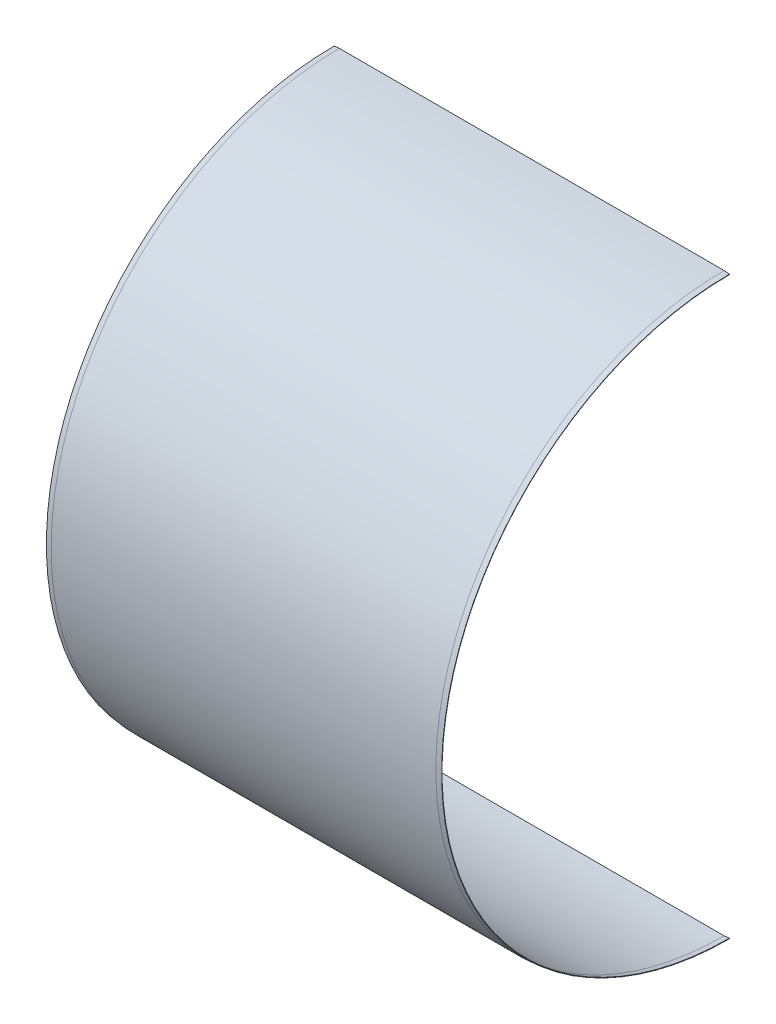
ISO-10303-21;
HEADER;
FILE_DESCRIPTION(('STEP AP214'),'2;1');
FILE_NAME('part.step','',(''),(''),'','','');
FILE_SCHEMA(('AUTOMOTIVE_DESIGN { 1 0 10303 214 1 1 1 1 }'));
ENDSEC;
DATA;
#1=APPLICATION_CONTEXT('core data for automotive mechanical design processes');
#2=APPLICATION_PROTOCOL_DEFINITION('international standard','automotive_design',2000,#1);
#3=PRODUCT_CONTEXT('',#1,'mechanical');
#4=PRODUCT('Part','Part','',(#3));
#5=PRODUCT_RELATED_PRODUCT_CATEGORY('part','',(#4));
#6=PRODUCT_DEFINITION_FORMATION('','',#4);
#7=PRODUCT_DEFINITION_CONTEXT('part definition',#1,'design');
#8=PRODUCT_DEFINITION('design','',#6,#7);
#9=PRODUCT_DEFINITION_SHAPE('','',#8);
#10=(LENGTH_UNIT() NAMED_UNIT(*) SI_UNIT(.MILLI.,.METRE.));
#11=(NAMED_UNIT(*) PLANE_ANGLE_UNIT() SI_UNIT($,.RADIAN.));
#12=(NAMED_UNIT(*) SI_UNIT($,.STERADIAN.) SOLID_ANGLE_UNIT());
#13=UNCERTAINTY_MEASURE_WITH_UNIT(LENGTH_MEASURE(1.E-05),#10,'distance_accuracy_value','');
#14=(GEOMETRIC_REPRESENTATION_CONTEXT(3) GLOBAL_UNCERTAINTY_ASSIGNED_CONTEXT((#13)) GLOBAL_UNIT_ASSIGNED_CONTEXT((#10,
#11,#12)) REPRESENTATION_CONTEXT('',''));
#15=CARTESIAN_POINT('',(0.,0.,0.));
#16=DIRECTION('',(0.,0.,1.));
#17=DIRECTION('',(1.,0.,0.));
#18=AXIS2_PLACEMENT_3D('',#15,#16,#17);
#19=CARTESIAN_POINT('',(1911.91539869116,-875.22,0.));
#20=DIRECTION('',(1.,0.,0.));
#21=DIRECTION('',(0.,0.,-1.));
#22=AXIS2_PLACEMENT_3D('',#19,#20,#21);
#23=CONICAL_SURFACE('',#22,1188.04943170276,1.45333466335403);
#24=DIRECTION('',(0.117191741876721,-0.993109306992891,0.));
#25=VECTOR('',#24,1.);
#26=CARTESIAN_POINT('',(1911.91539869116,-2063.26943170276,-7.76850490743907E-12));
#27=LINE('',#26,#25);
#28=CARTESIAN_POINT('',(1911.91539869116,-2063.26943170276,-8.29610484082676E-12));
#29=VERTEX_POINT('',#28);
#30=CARTESIAN_POINT('',(1912.14978217492,-2065.25565031675,-7.78149253963538E-12));
#31=VERTEX_POINT('',#30);
#32=EDGE_CURVE('E11',#29,#31,#27,.T.);
#33=ORIENTED_EDGE('',*,*,#32,.F.);
#34=CARTESIAN_POINT('',(1911.91539869116,-875.22,0.));
#35=DIRECTION('',(1.,0.,0.));
#36=DIRECTION('',(0.,0.,-1.));
#37=AXIS2_PLACEMENT_3D('',#34,#35,#36);
#38=CIRCLE('',#37,1188.04943170276);
#39=CARTESIAN_POINT('',(1911.91539869116,312.829431702761,0.));
#40=VERTEX_POINT('',#39);
#41=EDGE_CURVE('E99',#40,#29,#38,.T.);
#42=ORIENTED_EDGE('',*,*,#41,.F.);
#43=DIRECTION('',(0.117191741876721,0.993109306992891,0.));
#44=VECTOR('',#43,1.);
#45=CARTESIAN_POINT('',(1911.91539869116,312.829431702761,0.));
#46=LINE('',#45,#44);
#47=CARTESIAN_POINT('',(1912.14978217492,314.815650316747,0.));
#48=VERTEX_POINT('',#47);
#49=EDGE_CURVE('E50',#40,#48,#46,.T.);
#50=ORIENTED_EDGE('',*,*,#49,.T.);
#51=CARTESIAN_POINT('',(1912.14978217492,-875.22,0.));
#52=DIRECTION('',(1.,0.,0.));
#53=DIRECTION('',(0.,1.,0.));
#54=AXIS2_PLACEMENT_3D('',#51,#52,#53);
#55=CIRCLE('',#54,1190.03565031675);
#56=EDGE_CURVE('E100',#48,#31,#55,.T.);
#57=ORIENTED_EDGE('',*,*,#56,.T.);
#58=EDGE_LOOP('',(#33,#42,#50,#57));
#59=FACE_BOUND('',#58,.T.);
#60=ADVANCED_FACE('F40',(#59),#23,.F.);
#61=CARTESIAN_POINT('',(289.014794139918,314.009712182907,0.));
#62=DIRECTION('',(0.,0.,-1.));
#63=DIRECTION('',(-1.,0.,0.));
#64=AXIS2_PLACEMENT_3D('',#61,#62,#63);
#65=PLANE('',#64);
#66=CARTESIAN_POINT('',(299.574201620825,316.99998279125,0.));
#67=CARTESIAN_POINT('',(299.463111554415,317.000095140798,0.));
#68=CARTESIAN_POINT('',(299.352063880271,316.998109022774,0.));
#69=CARTESIAN_POINT('',(299.115380516928,316.990847333045,0.));
#70=CARTESIAN_POINT('',(298.989756284016,316.985171750881,0.));
#71=CARTESIAN_POINT('',(298.719980940069,316.971185530631,0.));
#72=CARTESIAN_POINT('',(298.57584563504,316.962608910708,0.));
#73=CARTESIAN_POINT('',(298.268468799749,316.942795234226,0.));
#74=CARTESIAN_POINT('',(298.105240174046,316.931355964855,0.));
#75=CARTESIAN_POINT('',(297.560908517216,316.891354916137,0.));
#76=CARTESIAN_POINT('',(297.179990625245,316.860330394849,0.));
#77=CARTESIAN_POINT('',(296.353566921056,316.789812874307,0.));
#78=CARTESIAN_POINT('',(295.908108747963,316.749777454621,0.));
#79=CARTESIAN_POINT('',(294.964125539325,316.662366856784,0.));
#80=CARTESIAN_POINT('',(294.465628871142,316.614686652939,0.));
#81=CARTESIAN_POINT('',(293.427849869989,316.513373778466,0.));
#82=CARTESIAN_POINT('',(292.88858396396,316.459574016782,0.));
#83=CARTESIAN_POINT('',(291.781847282193,316.347482374758,0.));
#84=CARTESIAN_POINT('',(291.214385380061,316.289103077629,0.));
#85=CARTESIAN_POINT('',(290.063975302408,316.169362338457,0.));
#86=CARTESIAN_POINT('',(289.481031076599,316.107963046743,0.));
#87=CARTESIAN_POINT('',(287.736760113837,315.922553423281,0.));
#88=CARTESIAN_POINT('',(286.575609865129,315.796882189937,0.));
#89=CARTESIAN_POINT('',(284.345213432765,315.552250089243,0.));
#90=CARTESIAN_POINT('',(283.275939462437,315.433541391109,0.));
#91=CARTESIAN_POINT('',(281.332100440244,315.215549589535,0.));
#92=CARTESIAN_POINT('',(280.4574914279,315.116660008067,0.));
#93=CARTESIAN_POINT('',(279.005357494895,314.950134138131,0.));
#94=CARTESIAN_POINT('',(278.427742702427,314.883280862014,0.));
#95=CARTESIAN_POINT('',(277.850217826863,314.815650316957,0.));
#96=B_SPLINE_CURVE_WITH_KNOTS('',3,(#66,#67,#68,#69,#70,#71,#72,#73,#74,#75,#76,#77,#78,#79,#80,
#81,#82,#83,#84,#85,#86,#87,#88,#89,#90,#91,#92,#93,#94,#95),.UNSPECIFIED.,.F.,.F.,(4,2,2,2,2,2,
2,2,2,2,2,2,2,2,4),(0.,0.333186586731813,0.710403054472625,1.14357083288589,1.63444936843314,
2.78095991729474,4.12271323997377,5.62502197622652,7.25084772140366,8.96221642515969,
10.7207215719142,14.2245074586023,17.4520350685093,20.0925772254438,21.8369888856608),.UNSPECIFIED.);
#97=CARTESIAN_POINT('',(299.569676183435,317.,0.));
#98=VERTEX_POINT('',#97);
#99=CARTESIAN_POINT('',(277.850217825082,314.815650316747,0.));
#100=VERTEX_POINT('',#99);
#101=EDGE_CURVE('E159',#98,#100,#96,.T.);
#102=ORIENTED_EDGE('',*,*,#101,.F.);
#103=DIRECTION('',(1.,0.,0.));
#104=VECTOR('',#103,1.);
#105=CARTESIAN_POINT('',(0.,317.,0.));
#106=LINE('',#105,#104);
#107=CARTESIAN_POINT('',(1890.43032381661,317.,0.));
#108=VERTEX_POINT('',#107);
#109=EDGE_CURVE('E171',#108,#98,#106,.F.);
#110=ORIENTED_EDGE('',*,*,#109,.F.);
#111=CARTESIAN_POINT('',(1912.1497821745,314.815650316796,0.));
#112=CARTESIAN_POINT('',(1911.5722572972,314.883280862058,0.));
#113=CARTESIAN_POINT('',(1910.99464250299,314.950134138376,0.));
#114=CARTESIAN_POINT('',(1909.54250857251,315.116660008015,0.));
#115=CARTESIAN_POINT('',(1908.66789956443,315.215549589005,0.));
#116=CARTESIAN_POINT('',(1906.72406054462,315.433541390325,0.));
#117=CARTESIAN_POINT('',(1905.65478657242,315.552250088672,0.));
#118=CARTESIAN_POINT('',(1903.42439014008,315.796882189369,0.));
#119=CARTESIAN_POINT('',(1902.26323989327,315.922553422513,0.));
#120=CARTESIAN_POINT('',(1900.5189689292,316.107963046133,0.));
#121=CARTESIAN_POINT('',(1899.93602470019,316.169362338188,0.));
#122=CARTESIAN_POINT('',(1898.78561462199,316.289103077415,0.));
#123=CARTESIAN_POINT('',(1898.21815272253,316.347482374271,0.));
#124=CARTESIAN_POINT('',(1897.11141604097,316.45957401629,0.));
#125=CARTESIAN_POINT('',(1896.57215013248,316.513373778226,0.));
#126=CARTESIAN_POINT('',(1895.53437112901,316.614686652924,0.));
#127=CARTESIAN_POINT('',(1895.03587446097,316.662366856755,0.));
#128=CARTESIAN_POINT('',(1894.09189125281,316.74977745455,0.));
#129=CARTESIAN_POINT('',(1893.64643308005,316.789812874208,0.));
#130=CARTESIAN_POINT('',(1892.82000937554,316.860330394786,0.));
#131=CARTESIAN_POINT('',(1892.43909148293,316.891354916128,0.));
#132=CARTESIAN_POINT('',(1891.89475982604,316.931355964848,0.));
#133=CARTESIAN_POINT('',(1891.73153120093,316.94279523418,0.));
#134=CARTESIAN_POINT('',(1891.42415436612,316.962608910636,0.));
#135=CARTESIAN_POINT('',(1891.28001906099,316.971185530566,0.));
#136=CARTESIAN_POINT('',(1891.01024370863,316.985171751271,0.));
#137=CARTESIAN_POINT('',(1890.8846194674,316.990847333773,0.));
#138=CARTESIAN_POINT('',(1890.64793610376,316.99810902308,0.));
#139=CARTESIAN_POINT('',(1890.53688843765,317.000095140807,0.));
#140=CARTESIAN_POINT('',(1890.42579837927,316.999982791251,0.));
#141=B_SPLINE_CURVE_WITH_KNOTS('',3,(#111,#112,#113,#114,#115,#116,#117,#118,#119,#120,#121,
#122,#123,#124,#125,#126,#127,#128,#129,#130,#131,#132,#133,#134,#135,#136,#137,#138,#139,#140),
.UNSPECIFIED.,.F.,.F.,(4,2,2,2,2,2,2,2,2,2,2,2,2,2,4),(0.,1.74441166546914,4.38495380953207,
7.61248142510624,11.1162673060556,12.8747724624949,14.586141158194,16.2119669108071,
17.7142756466086,19.0560289683033,20.2025395191054,20.6934180528818,21.1265858316031,
21.5038023243024,21.8369888869384),.UNSPECIFIED.);
#142=EDGE_CURVE('E183',#48,#108,#141,.T.);
#143=ORIENTED_EDGE('',*,*,#142,.F.);
#144=ORIENTED_EDGE('',*,*,#49,.F.);
#145=CARTESIAN_POINT('',(1911.91539869116,312.829431702761,0.));
#146=CARTESIAN_POINT('',(1908.77892497125,313.199550899107,0.));
#147=CARTESIAN_POINT('',(1892.81240473059,315.009866129759,0.));
#148=CARTESIAN_POINT('',(1890.43409504732,315.,0.));
#149=B_SPLINE_CURVE_WITH_KNOTS('',3,(#145,#146,#147,#148),.UNSPECIFIED.,.F.,.F.,(4,4),(0.,1.),.UNSPECIFIED.);
#150=CARTESIAN_POINT('',(1890.43409504732,315.,0.));
#151=VERTEX_POINT('',#150);
#152=EDGE_CURVE('E111',#40,#151,#149,.T.);
#153=ORIENTED_EDGE('',*,*,#152,.T.);
#154=DIRECTION('',(-1.,0.,0.));
#155=VECTOR('',#154,1.);
#156=CARTESIAN_POINT('',(1890.43409504732,315.,0.));
#157=LINE('',#156,#155);
#158=CARTESIAN_POINT('',(299.565904952678,315.,0.));
#159=VERTEX_POINT('',#158);
#160=EDGE_CURVE('E141',#151,#159,#157,.T.);
#161=ORIENTED_EDGE('',*,*,#160,.T.);
#162=CARTESIAN_POINT('',(299.565904952678,315.,0.));
#163=CARTESIAN_POINT('',(297.187595269406,315.009866129759,0.));
#164=CARTESIAN_POINT('',(281.221075028754,313.199550899107,0.));
#165=CARTESIAN_POINT('',(278.084601308835,312.829431702761,0.));
#166=B_SPLINE_CURVE_WITH_KNOTS('',3,(#162,#163,#164,#165),.UNSPECIFIED.,.F.,.F.,(4,4),(0.,1.),.UNSPECIFIED.);
#167=CARTESIAN_POINT('',(278.084601308835,312.829431702761,0.));
#168=VERTEX_POINT('',#167);
#169=EDGE_CURVE('E131',#159,#168,#166,.T.);
#170=ORIENTED_EDGE('',*,*,#169,.T.);
#171=DIRECTION('',(-0.117191741876717,0.993109306992891,0.));
#172=VECTOR('',#171,1.);
#173=CARTESIAN_POINT('',(278.084601308835,312.829431702761,0.));
#174=LINE('',#173,#172);
#175=EDGE_CURVE('E151',#168,#100,#174,.T.);
#176=ORIENTED_EDGE('',*,*,#175,.T.);
#177=EDGE_LOOP('',(#102,#110,#143,#144,#153,#161,#170,#176));
#178=FACE_BOUND('',#177,.T.);
#179=ADVANCED_FACE('F258',(#178),#65,.T.);
#180=CARTESIAN_POINT('',(278.084601308835,-875.22,0.));
#181=DIRECTION('',(-1.,0.,0.));
#182=DIRECTION('',(0.,0.,1.));
#183=AXIS2_PLACEMENT_3D('',#180,#181,#182);
#184=CONICAL_SURFACE('',#183,1188.04943170276,1.45333466335404);
#185=ORIENTED_EDGE('',*,*,#175,.F.);
#186=CARTESIAN_POINT('',(278.084601308835,-875.22,0.));
#187=DIRECTION('',(1.,0.,0.));
#188=DIRECTION('',(0.,0.,-1.));
#189=AXIS2_PLACEMENT_3D('',#186,#187,#188);
#190=CIRCLE('',#189,1188.04943170276);
#191=CARTESIAN_POINT('',(278.084601308835,-2063.26943170276,-8.29610484082676E-12));
#192=VERTEX_POINT('',#191);
#193=EDGE_CURVE('E142',#168,#192,#190,.T.);
#194=ORIENTED_EDGE('',*,*,#193,.T.);
#195=DIRECTION('',(-0.117191741876717,-0.993109306992891,0.));
#196=VECTOR('',#195,1.);
#197=CARTESIAN_POINT('',(278.084601308835,-2063.26943170276,-7.76850490743907E-12));
#198=LINE('',#197,#196);
#199=CARTESIAN_POINT('',(277.850217825082,-2065.25565031675,-7.78149253963538E-12));
#200=VERTEX_POINT('',#199);
#201=EDGE_CURVE('E147',#192,#200,#198,.T.);
#202=ORIENTED_EDGE('',*,*,#201,.T.);
#203=CARTESIAN_POINT('',(277.850217825082,-875.22,0.));
#204=DIRECTION('',(1.,0.,0.));
#205=DIRECTION('',(0.,1.,0.));
#206=AXIS2_PLACEMENT_3D('',#203,#204,#205);
#207=CIRCLE('',#206,1190.03565031675);
#208=EDGE_CURVE('E152',#100,#200,#207,.T.);
#209=ORIENTED_EDGE('',*,*,#208,.F.);
#210=EDGE_LOOP('',(#185,#194,#202,#209));
#211=FACE_BOUND('',#210,.T.);
#212=ADVANCED_FACE('F255',(#211),#184,.F.);
#213=CARTESIAN_POINT('',(1095.,-2065.44,-8.31126183823575E-12));
#214=DIRECTION('',(0.,0.,1.));
#215=DIRECTION('',(-1.,0.,0.));
#216=AXIS2_PLACEMENT_3D('',#213,#214,#215);
#217=PLANE('',#216);
#218=DIRECTION('',(-1.,0.,0.));
#219=VECTOR('',#218,1.);
#220=CARTESIAN_POINT('',(1890.43409504732,-2065.44,-8.31126183823575E-12));
#221=LINE('',#220,#219);
#222=CARTESIAN_POINT('',(1890.43409504732,-2065.44,-8.31126183823575E-12));
#223=VERTEX_POINT('',#222);
#224=CARTESIAN_POINT('',(299.565904952678,-2065.44,-8.31126183823575E-12));
#225=VERTEX_POINT('',#224);
#226=EDGE_CURVE('E115',#223,#225,#221,.T.);
#227=ORIENTED_EDGE('',*,*,#226,.F.);
#228=CARTESIAN_POINT('',(1911.91539869116,-2063.26943170276,-8.29610484082676E-12));
#229=CARTESIAN_POINT('',(1908.77892497125,-2063.63955089911,-8.29868936936114E-12));
#230=CARTESIAN_POINT('',(1892.81240473059,-2065.44986612976,-8.31133073305163E-12));
#231=CARTESIAN_POINT('',(1890.43409504732,-2065.44,-8.31126183823575E-12));
#232=B_SPLINE_CURVE_WITH_KNOTS('',3,(#228,#229,#230,#231),.UNSPECIFIED.,.F.,.F.,(4,4),(0.,1.),.UNSPECIFIED.);
#233=EDGE_CURVE('E108',#29,#223,#232,.T.);
#234=ORIENTED_EDGE('',*,*,#233,.F.);
#235=ORIENTED_EDGE('',*,*,#32,.T.);
#236=CARTESIAN_POINT('',(1912.1497821745,-2065.2556503168,-7.76850490743907E-12));
#237=CARTESIAN_POINT('',(1911.5722572972,-2065.32328086206,-7.76894472544408E-12));
#238=CARTESIAN_POINT('',(1910.99464250299,-2065.39013413838,-7.76938025081832E-12));
#239=CARTESIAN_POINT('',(1909.54250857251,-2065.55666000802,-7.77046620734425E-12));
#240=CARTESIAN_POINT('',(1908.66789956443,-2065.65554958901,-7.77111210231519E-12));
#241=CARTESIAN_POINT('',(1906.72406054194,-2065.87354139063,-7.77253559670581E-12));
#242=CARTESIAN_POINT('',(1905.65478656706,-2065.99225008927,-7.77331055605977E-12));
#243=CARTESIAN_POINT('',(1903.42439013213,-2066.23688219023,-7.77490746704708E-12));
#244=CARTESIAN_POINT('',(1902.26323988541,-2066.36255342336,-7.77572776329403E-12));
#245=CARTESIAN_POINT('',(1900.51896892402,-2066.54796304668,-7.77693743331221E-12));
#246=CARTESIAN_POINT('',(1899.93602469759,-2066.60936233846,-7.77733792614919E-12));
#247=CARTESIAN_POINT('',(1898.78561462199,-2066.72910307741,-7.77811869256527E-12));
#248=CARTESIAN_POINT('',(1898.21815272253,-2066.78748237427,-7.77849922036445E-12));
#249=CARTESIAN_POINT('',(1897.11141604391,-2066.89957401599,-7.77922942571507E-12));
#250=CARTESIAN_POINT('',(1896.57215013834,-2066.95337377764,-7.77957969456656E-12));
#251=CARTESIAN_POINT('',(1895.53437113488,-2067.05468665236,-7.78023863691722E-12));
#252=CARTESIAN_POINT('',(1895.03587446391,-2067.10236685648,-7.78054844883775E-12));
#253=CARTESIAN_POINT('',(1894.09189124909,-2067.18977745489,-7.78111527883022E-12));
#254=CARTESIAN_POINT('',(1893.64643307259,-2067.22981287488,-7.78137440052497E-12));
#255=CARTESIAN_POINT('',(1892.82000935896,-2067.30033039617,-7.78182896616363E-12));
#256=CARTESIAN_POINT('',(1892.43909146095,-2067.3313549179,-7.78202818939489E-12));
#257=CARTESIAN_POINT('',(1891.89475980256,-2067.37135596651,-7.78228199711757E-12));
#258=CARTESIAN_POINT('',(1891.73153118135,-2067.3827952355,-7.78235414480254E-12));
#259=CARTESIAN_POINT('',(1891.42415435567,-2067.40260891126,-7.7824778665917E-12));
#260=CARTESIAN_POINT('',(1891.28001905576,-2067.41118553084,-7.78253086224217E-12));
#261=CARTESIAN_POINT('',(1891.01024370863,-2067.42517175127,-7.78261494114626E-12));
#262=CARTESIAN_POINT('',(1890.8846194674,-2067.43084733377,-7.78264797057848E-12));
#263=CARTESIAN_POINT('',(1890.64793610376,-2067.43810902308,-7.78268909775834E-12));
#264=CARTESIAN_POINT('',(1890.53688843765,-2067.44009514081,-7.78269965560956E-12));
#265=CARTESIAN_POINT('',(1890.42579837927,-2067.43998279125,-7.78269797888801E-12));
#266=B_SPLINE_CURVE_WITH_KNOTS('',3,(#236,#237,#238,#239,#240,#241,#242,#243,#244,#245,#246,
#247,#248,#249,#250,#251,#252,#253,#254,#255,#256,#257,#258,#259,#260,#261,#262,#263,#264,#265),
.UNSPECIFIED.,.F.,.F.,(4,2,2,2,2,2,2,2,2,2,2,2,2,2,4),(0.,1.74441166546914,4.38495380953212,
7.61248143319288,11.116267313873,12.8747724624949,14.586141158194,16.2119669019644,
17.7142756466086,19.05602897953,20.2025395465609,20.6934180685842,21.1265858316029,
21.5038023243023,21.8369888869382),.UNSPECIFIED.);
#267=CARTESIAN_POINT('',(1890.43032381661,-2067.44,-8.02400053453541E-12));
#268=VERTEX_POINT('',#267);
#269=EDGE_CURVE('E146',#31,#268,#266,.T.);
#270=ORIENTED_EDGE('',*,*,#269,.T.);
#271=DIRECTION('',(1.,0.,0.));
#272=VECTOR('',#271,1.);
#273=CARTESIAN_POINT('',(0.,-2067.44,-8.25222534324715E-12));
#274=LINE('',#273,#272);
#275=CARTESIAN_POINT('',(299.569676183435,-2067.44,-8.25222534324715E-12));
#276=VERTEX_POINT('',#275);
#277=EDGE_CURVE('E175',#268,#276,#274,.F.);
#278=ORIENTED_EDGE('',*,*,#277,.T.);
#279=CARTESIAN_POINT('',(299.574201620825,-2067.43998279125,-7.78269797888801E-12));
#280=CARTESIAN_POINT('',(299.463111562116,-2067.44009514081,-7.78269965560979E-12));
#281=CARTESIAN_POINT('',(299.352063895666,-2067.43810902307,-7.78268909775853E-12));
#282=CARTESIAN_POINT('',(299.11538053231,-2067.43084733376,-7.78264797057844E-12));
#283=CARTESIAN_POINT('',(298.989756291704,-2067.42517175128,-7.7826149411462E-12));
#284=CARTESIAN_POINT('',(298.719980945296,-2067.4111855309,-7.78253086224205E-12));
#285=CARTESIAN_POINT('',(298.57584564549,-2067.40260891133,-7.78247786659152E-12));
#286=CARTESIAN_POINT('',(298.268468819325,-2067.38279523555,-7.78235414480247E-12));
#287=CARTESIAN_POINT('',(298.105240197526,-2067.37135596652,-7.78228199711767E-12));
#288=CARTESIAN_POINT('',(297.560908539192,-2067.33135491791,-7.78202818939559E-12));
#289=CARTESIAN_POINT('',(297.179990641824,-2067.30033039623,-7.78182896616371E-12));
#290=CARTESIAN_POINT('',(296.353566928511,-2067.22981287498,-7.78137440052428E-12));
#291=CARTESIAN_POINT('',(295.90810875169,-2067.18977745497,-7.78111527882954E-12));
#292=CARTESIAN_POINT('',(294.96412553639,-2067.10236685651,-7.78054844883865E-12));
#293=CARTESIAN_POINT('',(294.465628865273,-2067.05468665238,-7.78023863691988E-12));
#294=CARTESIAN_POINT('',(293.427849866868,-2066.95337377815,-7.77957969456709E-12));
#295=CARTESIAN_POINT('',(292.888583966516,-2066.89957401703,-7.77922942571109E-12));
#296=CARTESIAN_POINT('',(291.78184728768,-2066.78748237532,-7.77849922036144E-12));
#297=CARTESIAN_POINT('',(291.214385382804,-2066.72910307792,-7.77811869256841E-12));
#298=CARTESIAN_POINT('',(290.063975307592,-2066.609362339,-7.77733792615368E-12));
#299=CARTESIAN_POINT('',(289.481031086965,-2066.54796304784,-7.77693743331157E-12));
#300=CARTESIAN_POINT('',(287.736760126881,-2066.36255342469,-7.77572776328418E-12));
#301=CARTESIAN_POINT('',(286.575609875669,-2066.23688219108,-7.77490746704989E-12));
#302=CARTESIAN_POINT('',(284.345213441189,-2065.99225009017,-7.77331055606369E-12));
#303=CARTESIAN_POINT('',(283.275939471246,-2065.87354139209,-7.77253559670067E-12));
#304=CARTESIAN_POINT('',(281.332100446372,-2065.65554959023,-7.77111210231106E-12));
#305=CARTESIAN_POINT('',(280.457491430964,-2065.55666000842,-7.77046620734536E-12));
#306=CARTESIAN_POINT('',(279.005357494895,-2065.39013413813,-7.76938025082251E-12));
#307=CARTESIAN_POINT('',(278.427742702427,-2065.32328086201,-7.76894472544977E-12));
#308=CARTESIAN_POINT('',(277.850217826863,-2065.25565031696,-7.76850490743907E-12));
#309=B_SPLINE_CURVE_WITH_KNOTS('',3,(#279,#280,#281,#282,#283,#284,#285,#286,#287,#288,#289,
#290,#291,#292,#293,#294,#295,#296,#297,#298,#299,#300,#301,#302,#303,#304,#305,#306,#307,#308),
.UNSPECIFIED.,.F.,.F.,(4,2,2,2,2,2,2,2,2,2,2,2,2,2,4),(0.,0.333186563640612,0.710403054474009,
1.14357081718458,1.63444934097902,2.78095990606921,4.12271323997496,5.62502198507053,
7.25084771313065,8.96221642516089,10.7207215562803,14.2245074505168,17.4520350592584,
20.0925772254449,21.8369888856619),.UNSPECIFIED.);
#310=EDGE_CURVE('E163',#276,#200,#309,.T.);
#311=ORIENTED_EDGE('',*,*,#310,.T.);
#312=ORIENTED_EDGE('',*,*,#201,.F.);
#313=CARTESIAN_POINT('',(299.565904952678,-2065.44,-8.31126183823575E-12));
#314=CARTESIAN_POINT('',(297.187595269406,-2065.44986612976,-8.31133073305163E-12));
#315=CARTESIAN_POINT('',(281.221075028754,-2063.63955089911,-8.29868936936114E-12));
#316=CARTESIAN_POINT('',(278.084601308835,-2063.26943170276,-8.29610484082676E-12));
#317=B_SPLINE_CURVE_WITH_KNOTS('',3,(#313,#314,#315,#316),.UNSPECIFIED.,.F.,.F.,(4,4),(0.,1.),.UNSPECIFIED.);
#318=EDGE_CURVE('E123',#225,#192,#317,.T.);
#319=ORIENTED_EDGE('',*,*,#318,.F.);
#320=EDGE_LOOP('',(#227,#234,#235,#270,#278,#311,#312,#319));
#321=FACE_BOUND('',#320,.T.);
#322=ADVANCED_FACE('F42',(#321),#217,.F.);
#323=CARTESIAN_POINT('',(299.565904952678,315.,0.));
#324=CARTESIAN_POINT('',(297.187595269406,315.009866129759,0.));
#325=CARTESIAN_POINT('',(281.221075028754,313.199550899107,0.));
#326=CARTESIAN_POINT('',(278.084601308835,312.829431702761,0.));
#327=B_SPLINE_CURVE_WITH_KNOTS('',3,(#323,#324,#325,#326),.UNSPECIFIED.,.F.,.F.,(4,4),(0.,1.),.UNSPECIFIED.);
#328=CARTESIAN_POINT('',(0.,-875.22,0.));
#329=DIRECTION('',(1.,0.,0.));
#330=AXIS1_PLACEMENT('',#328,#329);
#331=SURFACE_OF_REVOLUTION('',#327,#330);
#332=OFFSET_SURFACE('',#331,-2.,.F.);
#333=ORIENTED_EDGE('',*,*,#310,.F.);
#334=CARTESIAN_POINT('',(299.569676183435,-875.22,0.));
#335=DIRECTION('',(1.,0.,0.));
#336=DIRECTION('',(0.,0.,-1.));
#337=AXIS2_PLACEMENT_3D('',#334,#335,#336);
#338=CIRCLE('',#337,1192.22);
#339=EDGE_CURVE('E167',#98,#276,#338,.T.);
#340=ORIENTED_EDGE('',*,*,#339,.F.);
#341=ORIENTED_EDGE('',*,*,#101,.T.);
#342=ORIENTED_EDGE('',*,*,#208,.T.);
#343=EDGE_LOOP('',(#333,#340,#341,#342));
#344=FACE_BOUND('',#343,.T.);
#345=ADVANCED_FACE('F223',(#344),#332,.F.);
#346=CARTESIAN_POINT('',(0.,-875.22,0.));
#347=DIRECTION('',(1.,0.,0.));
#348=DIRECTION('',(0.,0.,-1.));
#349=AXIS2_PLACEMENT_3D('',#346,#347,#348);
#350=CYLINDRICAL_SURFACE('',#349,1192.22);
#351=ORIENTED_EDGE('',*,*,#277,.F.);
#352=CARTESIAN_POINT('',(1890.43032381661,-875.22,0.));
#353=DIRECTION('',(1.,0.,0.));
#354=DIRECTION('',(0.,0.,-1.));
#355=AXIS2_PLACEMENT_3D('',#352,#353,#354);
#356=CIRCLE('',#355,1192.22);
#357=EDGE_CURVE('E179',#108,#268,#356,.T.);
#358=ORIENTED_EDGE('',*,*,#357,.F.);
#359=ORIENTED_EDGE('',*,*,#109,.T.);
#360=ORIENTED_EDGE('',*,*,#339,.T.);
#361=EDGE_LOOP('',(#351,#358,#359,#360));
#362=FACE_BOUND('',#361,.T.);
#363=ADVANCED_FACE('F221',(#362),#350,.T.);
#364=CARTESIAN_POINT('',(1911.91539869116,312.829431702761,0.));
#365=CARTESIAN_POINT('',(1908.77892497125,313.199550899107,0.));
#366=CARTESIAN_POINT('',(1892.81240473059,315.009866129759,0.));
#367=CARTESIAN_POINT('',(1890.43409504732,315.,0.));
#368=B_SPLINE_CURVE_WITH_KNOTS('',3,(#364,#365,#366,#367),.UNSPECIFIED.,.F.,.F.,(4,4),(0.,1.),.UNSPECIFIED.);
#369=CARTESIAN_POINT('',(0.,-875.22,0.));
#370=DIRECTION('',(1.,0.,0.));
#371=AXIS1_PLACEMENT('',#369,#370);
#372=SURFACE_OF_REVOLUTION('',#368,#371);
#373=OFFSET_SURFACE('',#372,-2.,.F.);
#374=ORIENTED_EDGE('',*,*,#269,.F.);
#375=ORIENTED_EDGE('',*,*,#56,.F.);
#376=ORIENTED_EDGE('',*,*,#142,.T.);
#377=ORIENTED_EDGE('',*,*,#357,.T.);
#378=EDGE_LOOP('',(#374,#375,#376,#377));
#379=FACE_BOUND('',#378,.T.);
#380=ADVANCED_FACE('F217',(#379),#373,.F.);
#381=CARTESIAN_POINT('',(0.,-875.22,0.));
#382=DIRECTION('',(1.,0.,0.));
#383=AXIS1_PLACEMENT('',#381,#382);
#384=SURFACE_OF_REVOLUTION('',#166,#383);
#385=ORIENTED_EDGE('',*,*,#318,.T.);
#386=ORIENTED_EDGE('',*,*,#193,.F.);
#387=ORIENTED_EDGE('',*,*,#169,.F.);
#388=CARTESIAN_POINT('',(299.565904952678,-875.22,0.));
#389=DIRECTION('',(1.,0.,0.));
#390=DIRECTION('',(0.,0.,-1.));
#391=AXIS2_PLACEMENT_3D('',#388,#389,#390);
#392=CIRCLE('',#391,1190.22);
#393=EDGE_CURVE('E132',#159,#225,#392,.T.);
#394=ORIENTED_EDGE('',*,*,#393,.T.);
#395=EDGE_LOOP('',(#385,#386,#387,#394));
#396=FACE_BOUND('',#395,.T.);
#397=ADVANCED_FACE('F213',(#396),#384,.T.);
#398=CARTESIAN_POINT('',(0.,-875.22,0.));
#399=DIRECTION('',(1.,0.,0.));
#400=DIRECTION('',(0.,0.,-1.));
#401=AXIS2_PLACEMENT_3D('',#398,#399,#400);
#402=CYLINDRICAL_SURFACE('',#401,1190.22);
#403=ORIENTED_EDGE('',*,*,#226,.T.);
#404=ORIENTED_EDGE('',*,*,#393,.F.);
#405=ORIENTED_EDGE('',*,*,#160,.F.);
#406=CARTESIAN_POINT('',(1890.43409504732,-875.22,0.));
#407=DIRECTION('',(1.,0.,0.));
#408=DIRECTION('',(0.,0.,-1.));
#409=AXIS2_PLACEMENT_3D('',#406,#407,#408);
#410=CIRCLE('',#409,1190.22);
#411=EDGE_CURVE('E95',#151,#223,#410,.T.);
#412=ORIENTED_EDGE('',*,*,#411,.T.);
#413=EDGE_LOOP('',(#403,#404,#405,#412));
#414=FACE_BOUND('',#413,.T.);
#415=ADVANCED_FACE('F212',(#414),#402,.F.);
#416=CARTESIAN_POINT('',(0.,-875.22,0.));
#417=DIRECTION('',(1.,0.,0.));
#418=AXIS1_PLACEMENT('',#416,#417);
#419=SURFACE_OF_REVOLUTION('',#149,#418);
#420=ORIENTED_EDGE('',*,*,#233,.T.);
#421=ORIENTED_EDGE('',*,*,#411,.F.);
#422=ORIENTED_EDGE('',*,*,#152,.F.);
#423=ORIENTED_EDGE('',*,*,#41,.T.);
#424=EDGE_LOOP('',(#420,#421,#422,#423));
#425=FACE_BOUND('',#424,.T.);
#426=ADVANCED_FACE('F107',(#425),#419,.T.);
#427=CLOSED_SHELL('',(#60,#179,#212,#322,#345,#363,#380,#397,#415,#426));
#428=MANIFOLD_SOLID_BREP('B2',#427);
#429=ADVANCED_BREP_SHAPE_REPRESENTATION('',(#18,#428),#14);
#430=SHAPE_DEFINITION_REPRESENTATION(#9,#429);
ENDSEC;
END-ISO-10303-21;
